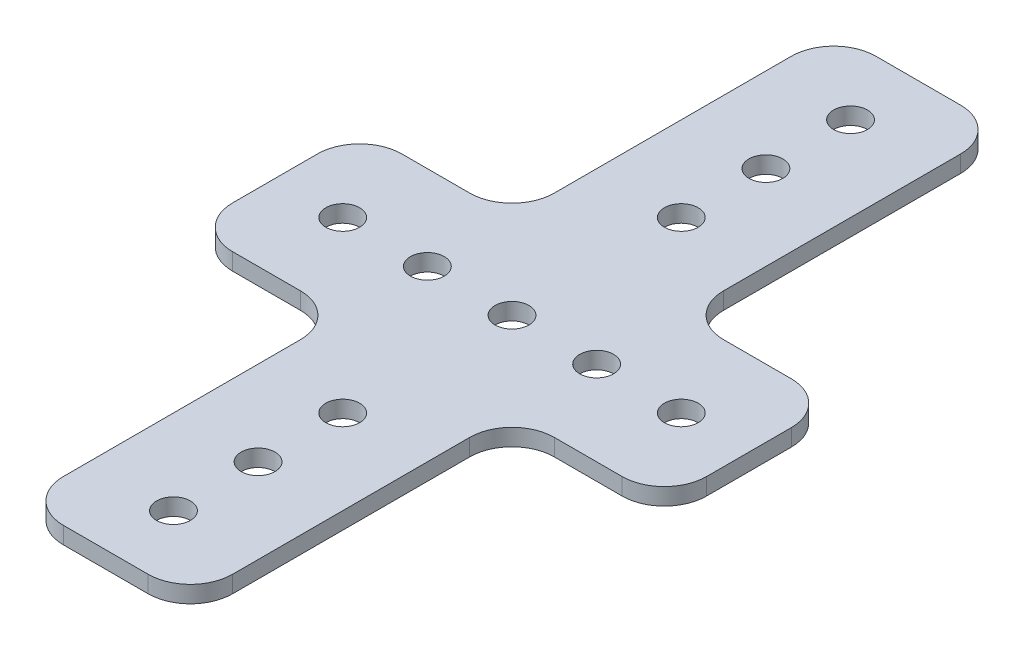
ISO-10303-21;
HEADER;
FILE_DESCRIPTION(('STEP AP214'),'2;1');
FILE_NAME('part.step','',(''),(''),'','','');
FILE_SCHEMA(('AUTOMOTIVE_DESIGN { 1 0 10303 214 1 1 1 1 }'));
ENDSEC;
DATA;
#1=APPLICATION_CONTEXT('core data for automotive mechanical design processes');
#2=APPLICATION_PROTOCOL_DEFINITION('international standard','automotive_design',2000,#1);
#3=PRODUCT_CONTEXT('',#1,'mechanical');
#4=PRODUCT('Part','Part','',(#3));
#5=PRODUCT_RELATED_PRODUCT_CATEGORY('part','',(#4));
#6=PRODUCT_DEFINITION_FORMATION('','',#4);
#7=PRODUCT_DEFINITION_CONTEXT('part definition',#1,'design');
#8=PRODUCT_DEFINITION('design','',#6,#7);
#9=PRODUCT_DEFINITION_SHAPE('','',#8);
#10=(LENGTH_UNIT() NAMED_UNIT(*) SI_UNIT(.MILLI.,.METRE.));
#11=(NAMED_UNIT(*) PLANE_ANGLE_UNIT() SI_UNIT($,.RADIAN.));
#12=(NAMED_UNIT(*) SI_UNIT($,.STERADIAN.) SOLID_ANGLE_UNIT());
#13=UNCERTAINTY_MEASURE_WITH_UNIT(LENGTH_MEASURE(1.E-05),#10,'distance_accuracy_value','');
#14=(GEOMETRIC_REPRESENTATION_CONTEXT(3) GLOBAL_UNCERTAINTY_ASSIGNED_CONTEXT((#13)) GLOBAL_UNIT_ASSIGNED_CONTEXT((#10,
#11,#12)) REPRESENTATION_CONTEXT('',''));
#15=CARTESIAN_POINT('',(0.,0.,0.));
#16=DIRECTION('',(0.,0.,1.));
#17=DIRECTION('',(1.,0.,0.));
#18=AXIS2_PLACEMENT_3D('',#15,#16,#17);
#19=CARTESIAN_POINT('',(0.,-2.,0.));
#20=DIRECTION('',(0.,-1.,0.));
#21=DIRECTION('',(0.,0.,-1.));
#22=AXIS2_PLACEMENT_3D('',#19,#20,#21);
#23=PLANE('',#22);
#24=CARTESIAN_POINT('',(0.,-2.,18.));
#25=DIRECTION('',(0.,1.,0.));
#26=DIRECTION('',(0.,0.,1.));
#27=AXIS2_PLACEMENT_3D('',#24,#25,#26);
#28=CIRCLE('',#27,1.99999999999999);
#29=CARTESIAN_POINT('',(0.,-2.,20.));
#30=VERTEX_POINT('',#29);
#31=EDGE_CURVE('E952',#30,#30,#28,.T.);
#32=ORIENTED_EDGE('',*,*,#31,.T.);
#33=EDGE_LOOP('',(#32));
#34=FACE_BOUND('',#33,.T.);
#35=CARTESIAN_POINT('',(10.,-2.,48.));
#36=DIRECTION('',(0.,1.,0.));
#37=DIRECTION('',(0.,0.,1.));
#38=AXIS2_PLACEMENT_3D('',#35,#36,#37);
#39=CIRCLE('',#38,1.99999999999999);
#40=CARTESIAN_POINT('',(10.,-2.,50.));
#41=VERTEX_POINT('',#40);
#42=EDGE_CURVE('E944',#41,#41,#39,.T.);
#43=ORIENTED_EDGE('',*,*,#42,.T.);
#44=EDGE_LOOP('',(#43));
#45=FACE_BOUND('',#44,.T.);
#46=DIRECTION('',(1.,0.,0.));
#47=VECTOR('',#46,1.);
#48=CARTESIAN_POINT('',(-10.,-2.,58.));
#49=LINE('',#48,#47);
#50=CARTESIAN_POINT('',(-23.,-2.,58.));
#51=VERTEX_POINT('',#50);
#52=CARTESIAN_POINT('',(-15.,-2.,58.));
#53=VERTEX_POINT('',#52);
#54=EDGE_CURVE('E453',#51,#53,#49,.T.);
#55=ORIENTED_EDGE('',*,*,#54,.F.);
#56=CARTESIAN_POINT('',(-23.,-2.,53.));
#57=DIRECTION('',(0.,-1.,0.));
#58=DIRECTION('',(0.,0.,-1.));
#59=AXIS2_PLACEMENT_3D('',#56,#57,#58);
#60=CIRCLE('',#59,5.);
#61=CARTESIAN_POINT('',(-28.,-2.,53.));
#62=VERTEX_POINT('',#61);
#63=EDGE_CURVE('E339',#51,#62,#60,.T.);
#64=ORIENTED_EDGE('',*,*,#63,.T.);
#65=DIRECTION('',(0.,0.,1.));
#66=VECTOR('',#65,1.);
#67=CARTESIAN_POINT('',(-28.,-2.,38.));
#68=LINE('',#67,#66);
#69=CARTESIAN_POINT('',(-28.,-2.,43.));
#70=VERTEX_POINT('',#69);
#71=EDGE_CURVE('E449',#70,#62,#68,.T.);
#72=ORIENTED_EDGE('',*,*,#71,.F.);
#73=CARTESIAN_POINT('',(-23.,-2.,43.));
#74=DIRECTION('',(0.,-1.,0.));
#75=DIRECTION('',(0.,0.,-1.));
#76=AXIS2_PLACEMENT_3D('',#73,#74,#75);
#77=CIRCLE('',#76,5.);
#78=CARTESIAN_POINT('',(-23.,-2.,38.));
#79=VERTEX_POINT('',#78);
#80=EDGE_CURVE('E63',#70,#79,#77,.T.);
#81=ORIENTED_EDGE('',*,*,#80,.T.);
#82=DIRECTION('',(-1.,0.,0.));
#83=VECTOR('',#82,1.);
#84=CARTESIAN_POINT('',(-28.,-2.,38.));
#85=LINE('',#84,#83);
#86=CARTESIAN_POINT('',(-15.,-2.,38.));
#87=VERTEX_POINT('',#86);
#88=EDGE_CURVE('E441',#87,#79,#85,.T.);
#89=ORIENTED_EDGE('',*,*,#88,.F.);
#90=CARTESIAN_POINT('',(-15.,-2.,33.));
#91=DIRECTION('',(0.,-1.,0.));
#92=DIRECTION('',(0.,0.,-1.));
#93=AXIS2_PLACEMENT_3D('',#90,#91,#92);
#94=CIRCLE('',#93,5.);
#95=CARTESIAN_POINT('',(-10.,-2.,33.));
#96=VERTEX_POINT('',#95);
#97=EDGE_CURVE('E224',#87,#96,#94,.F.);
#98=ORIENTED_EDGE('',*,*,#97,.T.);
#99=DIRECTION('',(0.,0.,1.));
#100=VECTOR('',#99,1.);
#101=CARTESIAN_POINT('',(-10.,-2.,38.));
#102=LINE('',#101,#100);
#103=CARTESIAN_POINT('',(-10.,-2.,5.));
#104=VERTEX_POINT('',#103);
#105=EDGE_CURVE('E228',#104,#96,#102,.T.);
#106=ORIENTED_EDGE('',*,*,#105,.F.);
#107=CARTESIAN_POINT('',(-5.,-2.,5.));
#108=DIRECTION('',(0.,-1.,0.));
#109=DIRECTION('',(0.,0.,-1.));
#110=AXIS2_PLACEMENT_3D('',#107,#108,#109);
#111=CIRCLE('',#110,5.);
#112=CARTESIAN_POINT('',(-5.,-2.,0.));
#113=VERTEX_POINT('',#112);
#114=EDGE_CURVE('E334',#104,#113,#111,.T.);
#115=ORIENTED_EDGE('',*,*,#114,.T.);
#116=DIRECTION('',(-1.,0.,0.));
#117=VECTOR('',#116,1.);
#118=CARTESIAN_POINT('',(-10.,-2.,0.));
#119=LINE('',#118,#117);
#120=CARTESIAN_POINT('',(5.,-2.,0.));
#121=VERTEX_POINT('',#120);
#122=EDGE_CURVE('E432',#121,#113,#119,.T.);
#123=ORIENTED_EDGE('',*,*,#122,.F.);
#124=CARTESIAN_POINT('',(5.,-2.,5.));
#125=DIRECTION('',(0.,-1.,0.));
#126=DIRECTION('',(0.,0.,-1.));
#127=AXIS2_PLACEMENT_3D('',#124,#125,#126);
#128=CIRCLE('',#127,5.);
#129=CARTESIAN_POINT('',(10.,-2.,5.));
#130=VERTEX_POINT('',#129);
#131=EDGE_CURVE('E331',#121,#130,#128,.T.);
#132=ORIENTED_EDGE('',*,*,#131,.T.);
#133=DIRECTION('',(0.,0.,-1.));
#134=VECTOR('',#133,1.);
#135=CARTESIAN_POINT('',(10.,-2.,0.));
#136=LINE('',#135,#134);
#137=CARTESIAN_POINT('',(9.99999999999999,-2.,33.));
#138=VERTEX_POINT('',#137);
#139=EDGE_CURVE('E231',#138,#130,#136,.T.);
#140=ORIENTED_EDGE('',*,*,#139,.F.);
#141=CARTESIAN_POINT('',(15.,-2.,33.));
#142=DIRECTION('',(0.,-1.,0.));
#143=DIRECTION('',(0.,0.,-1.));
#144=AXIS2_PLACEMENT_3D('',#141,#142,#143);
#145=CIRCLE('',#144,5.);
#146=CARTESIAN_POINT('',(15.,-2.,38.));
#147=VERTEX_POINT('',#146);
#148=EDGE_CURVE('E282',#138,#147,#145,.F.);
#149=ORIENTED_EDGE('',*,*,#148,.T.);
#150=DIRECTION('',(-1.,0.,0.));
#151=VECTOR('',#150,1.);
#152=CARTESIAN_POINT('',(9.99999999999999,-2.,38.));
#153=LINE('',#152,#151);
#154=CARTESIAN_POINT('',(23.,-2.,38.));
#155=VERTEX_POINT('',#154);
#156=EDGE_CURVE('E238',#155,#147,#153,.T.);
#157=ORIENTED_EDGE('',*,*,#156,.F.);
#158=CARTESIAN_POINT('',(23.,-2.,43.));
#159=DIRECTION('',(0.,-1.,0.));
#160=DIRECTION('',(0.,0.,-1.));
#161=AXIS2_PLACEMENT_3D('',#158,#159,#160);
#162=CIRCLE('',#161,5.);
#163=CARTESIAN_POINT('',(28.,-2.,43.));
#164=VERTEX_POINT('',#163);
#165=EDGE_CURVE('E328',#155,#164,#162,.T.);
#166=ORIENTED_EDGE('',*,*,#165,.T.);
#167=DIRECTION('',(0.,0.,-1.));
#168=VECTOR('',#167,1.);
#169=CARTESIAN_POINT('',(28.,-2.,58.));
#170=LINE('',#169,#168);
#171=CARTESIAN_POINT('',(28.,-2.,53.));
#172=VERTEX_POINT('',#171);
#173=EDGE_CURVE('E465',#172,#164,#170,.T.);
#174=ORIENTED_EDGE('',*,*,#173,.F.);
#175=CARTESIAN_POINT('',(23.,-2.,53.));
#176=DIRECTION('',(0.,-1.,0.));
#177=DIRECTION('',(0.,0.,-1.));
#178=AXIS2_PLACEMENT_3D('',#175,#176,#177);
#179=CIRCLE('',#178,5.);
#180=CARTESIAN_POINT('',(23.,-2.,58.));
#181=VERTEX_POINT('',#180);
#182=EDGE_CURVE('E325',#172,#181,#179,.T.);
#183=ORIENTED_EDGE('',*,*,#182,.T.);
#184=DIRECTION('',(1.,0.,0.));
#185=VECTOR('',#184,1.);
#186=CARTESIAN_POINT('',(28.,-2.,58.));
#187=LINE('',#186,#185);
#188=CARTESIAN_POINT('',(15.,-2.,58.));
#189=VERTEX_POINT('',#188);
#190=EDGE_CURVE('E397',#189,#181,#187,.T.);
#191=ORIENTED_EDGE('',*,*,#190,.F.);
#192=CARTESIAN_POINT('',(15.,-2.,63.));
#193=DIRECTION('',(0.,-1.,0.));
#194=DIRECTION('',(0.,0.,-1.));
#195=AXIS2_PLACEMENT_3D('',#192,#193,#194);
#196=CIRCLE('',#195,5.);
#197=CARTESIAN_POINT('',(10.,-2.,63.));
#198=VERTEX_POINT('',#197);
#199=EDGE_CURVE('E275',#189,#198,#196,.F.);
#200=ORIENTED_EDGE('',*,*,#199,.T.);
#201=DIRECTION('',(0.,0.,-1.));
#202=VECTOR('',#201,1.);
#203=CARTESIAN_POINT('',(10.,-2.,58.));
#204=LINE('',#203,#202);
#205=CARTESIAN_POINT('',(10.,-2.,91.));
#206=VERTEX_POINT('',#205);
#207=EDGE_CURVE('E385',#206,#198,#204,.T.);
#208=ORIENTED_EDGE('',*,*,#207,.F.);
#209=CARTESIAN_POINT('',(5.,-2.,91.));
#210=DIRECTION('',(0.,-1.,0.));
#211=DIRECTION('',(0.,0.,-1.));
#212=AXIS2_PLACEMENT_3D('',#209,#210,#211);
#213=CIRCLE('',#212,5.);
#214=CARTESIAN_POINT('',(5.,-2.,96.));
#215=VERTEX_POINT('',#214);
#216=EDGE_CURVE('E322',#206,#215,#213,.T.);
#217=ORIENTED_EDGE('',*,*,#216,.T.);
#218=DIRECTION('',(1.,0.,0.));
#219=VECTOR('',#218,1.);
#220=CARTESIAN_POINT('',(-10.,-2.,96.));
#221=LINE('',#220,#219);
#222=CARTESIAN_POINT('',(-5.,-2.,96.));
#223=VERTEX_POINT('',#222);
#224=EDGE_CURVE('E398',#223,#215,#221,.T.);
#225=ORIENTED_EDGE('',*,*,#224,.F.);
#226=CARTESIAN_POINT('',(-5.,-2.,91.));
#227=DIRECTION('',(0.,-1.,0.));
#228=DIRECTION('',(0.,0.,-1.));
#229=AXIS2_PLACEMENT_3D('',#226,#227,#228);
#230=CIRCLE('',#229,5.);
#231=CARTESIAN_POINT('',(-10.,-2.,91.));
#232=VERTEX_POINT('',#231);
#233=EDGE_CURVE('E319',#223,#232,#230,.T.);
#234=ORIENTED_EDGE('',*,*,#233,.T.);
#235=DIRECTION('',(0.,0.,1.));
#236=VECTOR('',#235,1.);
#237=CARTESIAN_POINT('',(-10.,-2.,96.));
#238=LINE('',#237,#236);
#239=CARTESIAN_POINT('',(-10.,-2.,63.));
#240=VERTEX_POINT('',#239);
#241=EDGE_CURVE('E456',#240,#232,#238,.T.);
#242=ORIENTED_EDGE('',*,*,#241,.F.);
#243=CARTESIAN_POINT('',(-15.,-2.,63.));
#244=DIRECTION('',(0.,-1.,0.));
#245=DIRECTION('',(0.,0.,-1.));
#246=AXIS2_PLACEMENT_3D('',#243,#244,#245);
#247=CIRCLE('',#246,5.);
#248=EDGE_CURVE('E268',#240,#53,#247,.F.);
#249=ORIENTED_EDGE('',*,*,#248,.T.);
#250=EDGE_LOOP('',(#55,#64,#72,#81,#89,#98,#106,#115,#123,#132,#140,#149,#157,#166,#174,#183,
#191,#200,#208,#217,#225,#234,#242,#249));
#251=FACE_BOUND('',#250,.T.);
#252=CARTESIAN_POINT('',(0.,-2.,8.));
#253=DIRECTION('',(0.,1.,0.));
#254=DIRECTION('',(0.,0.,1.));
#255=AXIS2_PLACEMENT_3D('',#252,#253,#254);
#256=CIRCLE('',#255,2.);
#257=CARTESIAN_POINT('',(0.,-2.,10.));
#258=VERTEX_POINT('',#257);
#259=EDGE_CURVE('E444',#258,#258,#256,.T.);
#260=ORIENTED_EDGE('',*,*,#259,.T.);
#261=EDGE_LOOP('',(#260));
#262=FACE_BOUND('',#261,.T.);
#263=CARTESIAN_POINT('',(20.,-2.,48.));
#264=DIRECTION('',(0.,1.,0.));
#265=DIRECTION('',(0.,0.,1.));
#266=AXIS2_PLACEMENT_3D('',#263,#264,#265);
#267=CIRCLE('',#266,2.);
#268=CARTESIAN_POINT('',(20.,-2.,50.));
#269=VERTEX_POINT('',#268);
#270=EDGE_CURVE('E878',#269,#269,#267,.T.);
#271=ORIENTED_EDGE('',*,*,#270,.T.);
#272=EDGE_LOOP('',(#271));
#273=FACE_BOUND('',#272,.T.);
#274=CARTESIAN_POINT('',(-20.,-2.,48.));
#275=DIRECTION('',(0.,1.,0.));
#276=DIRECTION('',(0.,0.,1.));
#277=AXIS2_PLACEMENT_3D('',#274,#275,#276);
#278=CIRCLE('',#277,2.);
#279=CARTESIAN_POINT('',(-20.,-2.,50.));
#280=VERTEX_POINT('',#279);
#281=EDGE_CURVE('E888',#280,#280,#278,.T.);
#282=ORIENTED_EDGE('',*,*,#281,.T.);
#283=EDGE_LOOP('',(#282));
#284=FACE_BOUND('',#283,.T.);
#285=CARTESIAN_POINT('',(0.,-2.,88.));
#286=DIRECTION('',(0.,1.,0.));
#287=DIRECTION('',(0.,0.,1.));
#288=AXIS2_PLACEMENT_3D('',#285,#286,#287);
#289=CIRCLE('',#288,2.);
#290=CARTESIAN_POINT('',(0.,-2.,90.));
#291=VERTEX_POINT('',#290);
#292=EDGE_CURVE('E896',#291,#291,#289,.T.);
#293=ORIENTED_EDGE('',*,*,#292,.T.);
#294=EDGE_LOOP('',(#293));
#295=FACE_BOUND('',#294,.T.);
#296=CARTESIAN_POINT('',(0.,-2.,68.));
#297=DIRECTION('',(0.,1.,0.));
#298=DIRECTION('',(0.,0.,1.));
#299=AXIS2_PLACEMENT_3D('',#296,#297,#298);
#300=CIRCLE('',#299,2.);
#301=CARTESIAN_POINT('',(0.,-2.,70.));
#302=VERTEX_POINT('',#301);
#303=EDGE_CURVE('E904',#302,#302,#300,.T.);
#304=ORIENTED_EDGE('',*,*,#303,.T.);
#305=EDGE_LOOP('',(#304));
#306=FACE_BOUND('',#305,.T.);
#307=CARTESIAN_POINT('',(0.,-2.,48.));
#308=DIRECTION('',(0.,1.,0.));
#309=DIRECTION('',(0.,0.,1.));
#310=AXIS2_PLACEMENT_3D('',#307,#308,#309);
#311=CIRCLE('',#310,2.);
#312=CARTESIAN_POINT('',(0.,-2.,50.));
#313=VERTEX_POINT('',#312);
#314=EDGE_CURVE('E912',#313,#313,#311,.T.);
#315=ORIENTED_EDGE('',*,*,#314,.T.);
#316=EDGE_LOOP('',(#315));
#317=FACE_BOUND('',#316,.T.);
#318=CARTESIAN_POINT('',(0.,-2.,28.));
#319=DIRECTION('',(0.,1.,0.));
#320=DIRECTION('',(0.,0.,1.));
#321=AXIS2_PLACEMENT_3D('',#318,#319,#320);
#322=CIRCLE('',#321,2.);
#323=CARTESIAN_POINT('',(0.,-2.,30.));
#324=VERTEX_POINT('',#323);
#325=EDGE_CURVE('E920',#324,#324,#322,.T.);
#326=ORIENTED_EDGE('',*,*,#325,.T.);
#327=EDGE_LOOP('',(#326));
#328=FACE_BOUND('',#327,.T.);
#329=CARTESIAN_POINT('',(0.,-2.,78.));
#330=DIRECTION('',(0.,1.,0.));
#331=DIRECTION('',(0.,0.,1.));
#332=AXIS2_PLACEMENT_3D('',#329,#330,#331);
#333=CIRCLE('',#332,1.99999999999999);
#334=CARTESIAN_POINT('',(0.,-2.,80.));
#335=VERTEX_POINT('',#334);
#336=EDGE_CURVE('E928',#335,#335,#333,.T.);
#337=ORIENTED_EDGE('',*,*,#336,.T.);
#338=EDGE_LOOP('',(#337));
#339=FACE_BOUND('',#338,.T.);
#340=CARTESIAN_POINT('',(-10.,-2.,48.));
#341=DIRECTION('',(0.,1.,0.));
#342=DIRECTION('',(0.,0.,1.));
#343=AXIS2_PLACEMENT_3D('',#340,#341,#342);
#344=CIRCLE('',#343,1.99999999999999);
#345=CARTESIAN_POINT('',(-10.,-2.,50.));
#346=VERTEX_POINT('',#345);
#347=EDGE_CURVE('E936',#346,#346,#344,.T.);
#348=ORIENTED_EDGE('',*,*,#347,.T.);
#349=EDGE_LOOP('',(#348));
#350=FACE_BOUND('',#349,.T.);
#351=ADVANCED_FACE('F39',(#34,#45,#251,#262,#273,#284,#295,#306,#317,#328,#339,#350),#23,.T.);
#352=CARTESIAN_POINT('',(-10.,-2.,0.));
#353=DIRECTION('',(0.,0.,-1.));
#354=DIRECTION('',(-1.,0.,0.));
#355=AXIS2_PLACEMENT_3D('',#352,#353,#354);
#356=PLANE('',#355);
#357=ORIENTED_EDGE('',*,*,#122,.T.);
#358=DIRECTION('',(0.,1.,0.));
#359=VECTOR('',#358,1.);
#360=CARTESIAN_POINT('',(-5.,-2.,0.));
#361=LINE('',#360,#359);
#362=CARTESIAN_POINT('',(-5.,0.,0.));
#363=VERTEX_POINT('',#362);
#364=EDGE_CURVE('E349',#113,#363,#361,.T.);
#365=ORIENTED_EDGE('',*,*,#364,.T.);
#366=DIRECTION('',(-1.,0.,0.));
#367=VECTOR('',#366,1.);
#368=CARTESIAN_POINT('',(-10.,0.,0.));
#369=LINE('',#368,#367);
#370=CARTESIAN_POINT('',(5.,0.,0.));
#371=VERTEX_POINT('',#370);
#372=EDGE_CURVE('E214',#371,#363,#369,.T.);
#373=ORIENTED_EDGE('',*,*,#372,.F.);
#374=DIRECTION('',(0.,1.,0.));
#375=VECTOR('',#374,1.);
#376=CARTESIAN_POINT('',(5.,-2.,0.));
#377=LINE('',#376,#375);
#378=EDGE_CURVE('E346',#371,#121,#377,.F.);
#379=ORIENTED_EDGE('',*,*,#378,.T.);
#380=EDGE_LOOP('',(#357,#365,#373,#379));
#381=FACE_BOUND('',#380,.T.);
#382=ADVANCED_FACE('F502',(#381),#356,.T.);
#383=CARTESIAN_POINT('',(10.,-2.,0.));
#384=DIRECTION('',(1.,0.,0.));
#385=DIRECTION('',(0.,0.,-1.));
#386=AXIS2_PLACEMENT_3D('',#383,#384,#385);
#387=PLANE('',#386);
#388=ORIENTED_EDGE('',*,*,#139,.T.);
#389=DIRECTION('',(0.,1.,0.));
#390=VECTOR('',#389,1.);
#391=CARTESIAN_POINT('',(10.,-2.,5.));
#392=LINE('',#391,#390);
#393=CARTESIAN_POINT('',(10.,0.,5.));
#394=VERTEX_POINT('',#393);
#395=EDGE_CURVE('E355',#130,#394,#392,.T.);
#396=ORIENTED_EDGE('',*,*,#395,.T.);
#397=DIRECTION('',(0.,0.,-1.));
#398=VECTOR('',#397,1.);
#399=CARTESIAN_POINT('',(10.,0.,0.));
#400=LINE('',#399,#398);
#401=CARTESIAN_POINT('',(9.99999999999999,0.,33.));
#402=VERTEX_POINT('',#401);
#403=EDGE_CURVE('E241',#402,#394,#400,.T.);
#404=ORIENTED_EDGE('',*,*,#403,.F.);
#405=DIRECTION('',(0.,1.,0.));
#406=VECTOR('',#405,1.);
#407=CARTESIAN_POINT('',(9.99999999999999,-2.,33.));
#408=LINE('',#407,#406);
#409=EDGE_CURVE('E225',#402,#138,#408,.F.);
#410=ORIENTED_EDGE('',*,*,#409,.T.);
#411=EDGE_LOOP('',(#388,#396,#404,#410));
#412=FACE_BOUND('',#411,.T.);
#413=ADVANCED_FACE('F508',(#412),#387,.T.);
#414=CARTESIAN_POINT('',(9.99999999999999,-2.,38.));
#415=DIRECTION('',(0.,0.,-1.));
#416=DIRECTION('',(-1.,0.,0.));
#417=AXIS2_PLACEMENT_3D('',#414,#415,#416);
#418=PLANE('',#417);
#419=DIRECTION('',(-1.,0.,0.));
#420=VECTOR('',#419,1.);
#421=CARTESIAN_POINT('',(9.99999999999999,0.,38.));
#422=LINE('',#421,#420);
#423=CARTESIAN_POINT('',(23.,0.,38.));
#424=VERTEX_POINT('',#423);
#425=CARTESIAN_POINT('',(15.,0.,38.));
#426=VERTEX_POINT('',#425);
#427=EDGE_CURVE('E426',#424,#426,#422,.T.);
#428=ORIENTED_EDGE('',*,*,#427,.F.);
#429=DIRECTION('',(0.,1.,0.));
#430=VECTOR('',#429,1.);
#431=CARTESIAN_POINT('',(23.,-2.,38.));
#432=LINE('',#431,#430);
#433=EDGE_CURVE('E366',#424,#155,#432,.F.);
#434=ORIENTED_EDGE('',*,*,#433,.T.);
#435=ORIENTED_EDGE('',*,*,#156,.T.);
#436=DIRECTION('',(0.,1.,0.));
#437=VECTOR('',#436,1.);
#438=CARTESIAN_POINT('',(15.,0.,38.));
#439=LINE('',#438,#437);
#440=EDGE_CURVE('E257',#147,#426,#439,.T.);
#441=ORIENTED_EDGE('',*,*,#440,.T.);
#442=EDGE_LOOP('',(#428,#434,#435,#441));
#443=FACE_BOUND('',#442,.T.);
#444=ADVANCED_FACE('F521',(#443),#418,.T.);
#445=CARTESIAN_POINT('',(28.,-2.,58.));
#446=DIRECTION('',(1.,0.,0.));
#447=DIRECTION('',(0.,0.,-1.));
#448=AXIS2_PLACEMENT_3D('',#445,#446,#447);
#449=PLANE('',#448);
#450=ORIENTED_EDGE('',*,*,#173,.T.);
#451=DIRECTION('',(0.,1.,0.));
#452=VECTOR('',#451,1.);
#453=CARTESIAN_POINT('',(28.,-2.,43.));
#454=LINE('',#453,#452);
#455=CARTESIAN_POINT('',(28.,0.,43.));
#456=VERTEX_POINT('',#455);
#457=EDGE_CURVE('E362',#164,#456,#454,.T.);
#458=ORIENTED_EDGE('',*,*,#457,.T.);
#459=DIRECTION('',(0.,0.,-1.));
#460=VECTOR('',#459,1.);
#461=CARTESIAN_POINT('',(28.,0.,58.));
#462=LINE('',#461,#460);
#463=CARTESIAN_POINT('',(28.,0.,53.));
#464=VERTEX_POINT('',#463);
#465=EDGE_CURVE('E423',#464,#456,#462,.T.);
#466=ORIENTED_EDGE('',*,*,#465,.F.);
#467=DIRECTION('',(0.,1.,0.));
#468=VECTOR('',#467,1.);
#469=CARTESIAN_POINT('',(28.,-2.,53.));
#470=LINE('',#469,#468);
#471=EDGE_CURVE('E359',#464,#172,#470,.F.);
#472=ORIENTED_EDGE('',*,*,#471,.T.);
#473=EDGE_LOOP('',(#450,#458,#466,#472));
#474=FACE_BOUND('',#473,.T.);
#475=ADVANCED_FACE('F525',(#474),#449,.T.);
#476=CARTESIAN_POINT('',(28.,-2.,58.));
#477=DIRECTION('',(0.,0.,1.));
#478=DIRECTION('',(1.,0.,0.));
#479=AXIS2_PLACEMENT_3D('',#476,#477,#478);
#480=PLANE('',#479);
#481=ORIENTED_EDGE('',*,*,#190,.T.);
#482=DIRECTION('',(0.,1.,0.));
#483=VECTOR('',#482,1.);
#484=CARTESIAN_POINT('',(23.,-2.,58.));
#485=LINE('',#484,#483);
#486=CARTESIAN_POINT('',(23.,0.,58.));
#487=VERTEX_POINT('',#486);
#488=EDGE_CURVE('E369',#181,#487,#485,.T.);
#489=ORIENTED_EDGE('',*,*,#488,.T.);
#490=DIRECTION('',(1.,0.,0.));
#491=VECTOR('',#490,1.);
#492=CARTESIAN_POINT('',(28.,0.,58.));
#493=LINE('',#492,#491);
#494=CARTESIAN_POINT('',(15.,0.,58.));
#495=VERTEX_POINT('',#494);
#496=EDGE_CURVE('E414',#495,#487,#493,.T.);
#497=ORIENTED_EDGE('',*,*,#496,.F.);
#498=DIRECTION('',(0.,1.,0.));
#499=VECTOR('',#498,1.);
#500=CARTESIAN_POINT('',(15.,-2.,58.));
#501=LINE('',#500,#499);
#502=EDGE_CURVE('E254',#495,#189,#501,.F.);
#503=ORIENTED_EDGE('',*,*,#502,.T.);
#504=EDGE_LOOP('',(#481,#489,#497,#503));
#505=FACE_BOUND('',#504,.T.);
#506=ADVANCED_FACE('F529',(#505),#480,.T.);
#507=CARTESIAN_POINT('',(10.,-2.,58.));
#508=DIRECTION('',(1.,0.,0.));
#509=DIRECTION('',(0.,0.,-1.));
#510=AXIS2_PLACEMENT_3D('',#507,#508,#509);
#511=PLANE('',#510);
#512=DIRECTION('',(0.,0.,-1.));
#513=VECTOR('',#512,1.);
#514=CARTESIAN_POINT('',(10.,0.,58.));
#515=LINE('',#514,#513);
#516=CARTESIAN_POINT('',(10.,0.,91.));
#517=VERTEX_POINT('',#516);
#518=CARTESIAN_POINT('',(10.,0.,63.));
#519=VERTEX_POINT('',#518);
#520=EDGE_CURVE('E386',#517,#519,#515,.T.);
#521=ORIENTED_EDGE('',*,*,#520,.F.);
#522=DIRECTION('',(0.,1.,0.));
#523=VECTOR('',#522,1.);
#524=CARTESIAN_POINT('',(10.,-2.,91.));
#525=LINE('',#524,#523);
#526=EDGE_CURVE('E48',#517,#206,#525,.F.);
#527=ORIENTED_EDGE('',*,*,#526,.T.);
#528=ORIENTED_EDGE('',*,*,#207,.T.);
#529=DIRECTION('',(0.,1.,0.));
#530=VECTOR('',#529,1.);
#531=CARTESIAN_POINT('',(10.,0.,63.));
#532=LINE('',#531,#530);
#533=EDGE_CURVE('E250',#198,#519,#532,.T.);
#534=ORIENTED_EDGE('',*,*,#533,.T.);
#535=EDGE_LOOP('',(#521,#527,#528,#534));
#536=FACE_BOUND('',#535,.T.);
#537=ADVANCED_FACE('F384',(#536),#511,.T.);
#538=CARTESIAN_POINT('',(-10.,-2.,96.));
#539=DIRECTION('',(0.,0.,1.));
#540=DIRECTION('',(1.,0.,0.));
#541=AXIS2_PLACEMENT_3D('',#538,#539,#540);
#542=PLANE('',#541);
#543=ORIENTED_EDGE('',*,*,#224,.T.);
#544=DIRECTION('',(0.,1.,0.));
#545=VECTOR('',#544,1.);
#546=CARTESIAN_POINT('',(5.,-2.,96.));
#547=LINE('',#546,#545);
#548=CARTESIAN_POINT('',(5.,0.,96.));
#549=VERTEX_POINT('',#548);
#550=EDGE_CURVE('E376',#215,#549,#547,.T.);
#551=ORIENTED_EDGE('',*,*,#550,.T.);
#552=DIRECTION('',(1.,0.,0.));
#553=VECTOR('',#552,1.);
#554=CARTESIAN_POINT('',(-10.,0.,96.));
#555=LINE('',#554,#553);
#556=CARTESIAN_POINT('',(-5.,0.,96.));
#557=VERTEX_POINT('',#556);
#558=EDGE_CURVE('E406',#557,#549,#555,.T.);
#559=ORIENTED_EDGE('',*,*,#558,.F.);
#560=DIRECTION('',(0.,1.,0.));
#561=VECTOR('',#560,1.);
#562=CARTESIAN_POINT('',(-5.,-2.,96.));
#563=LINE('',#562,#561);
#564=EDGE_CURVE('E373',#557,#223,#563,.F.);
#565=ORIENTED_EDGE('',*,*,#564,.T.);
#566=EDGE_LOOP('',(#543,#551,#559,#565));
#567=FACE_BOUND('',#566,.T.);
#568=ADVANCED_FACE('F405',(#567),#542,.T.);
#569=CARTESIAN_POINT('',(-10.,-2.,96.));
#570=DIRECTION('',(-1.,0.,0.));
#571=DIRECTION('',(0.,0.,1.));
#572=AXIS2_PLACEMENT_3D('',#569,#570,#571);
#573=PLANE('',#572);
#574=ORIENTED_EDGE('',*,*,#241,.T.);
#575=DIRECTION('',(0.,1.,0.));
#576=VECTOR('',#575,1.);
#577=CARTESIAN_POINT('',(-10.,-2.,91.));
#578=LINE('',#577,#576);
#579=CARTESIAN_POINT('',(-10.,0.,91.));
#580=VERTEX_POINT('',#579);
#581=EDGE_CURVE('E11',#232,#580,#578,.T.);
#582=ORIENTED_EDGE('',*,*,#581,.T.);
#583=DIRECTION('',(0.,0.,1.));
#584=VECTOR('',#583,1.);
#585=CARTESIAN_POINT('',(-10.,0.,96.));
#586=LINE('',#585,#584);
#587=CARTESIAN_POINT('',(-10.,0.,63.));
#588=VERTEX_POINT('',#587);
#589=EDGE_CURVE('E410',#588,#580,#586,.T.);
#590=ORIENTED_EDGE('',*,*,#589,.F.);
#591=DIRECTION('',(0.,1.,0.));
#592=VECTOR('',#591,1.);
#593=CARTESIAN_POINT('',(-10.,-2.,63.));
#594=LINE('',#593,#592);
#595=EDGE_CURVE('E247',#588,#240,#594,.F.);
#596=ORIENTED_EDGE('',*,*,#595,.T.);
#597=EDGE_LOOP('',(#574,#582,#590,#596));
#598=FACE_BOUND('',#597,.T.);
#599=ADVANCED_FACE('F494',(#598),#573,.T.);
#600=CARTESIAN_POINT('',(-10.,-2.,58.));
#601=DIRECTION('',(0.,0.,1.));
#602=DIRECTION('',(1.,0.,0.));
#603=AXIS2_PLACEMENT_3D('',#600,#601,#602);
#604=PLANE('',#603);
#605=DIRECTION('',(1.,0.,0.));
#606=VECTOR('',#605,1.);
#607=CARTESIAN_POINT('',(-10.,0.,58.));
#608=LINE('',#607,#606);
#609=CARTESIAN_POINT('',(-23.,0.,58.));
#610=VERTEX_POINT('',#609);
#611=CARTESIAN_POINT('',(-15.,0.,58.));
#612=VERTEX_POINT('',#611);
#613=EDGE_CURVE('E416',#610,#612,#608,.T.);
#614=ORIENTED_EDGE('',*,*,#613,.F.);
#615=DIRECTION('',(0.,1.,0.));
#616=VECTOR('',#615,1.);
#617=CARTESIAN_POINT('',(-23.,-2.,58.));
#618=LINE('',#617,#616);
#619=EDGE_CURVE('E316',#610,#51,#618,.F.);
#620=ORIENTED_EDGE('',*,*,#619,.T.);
#621=ORIENTED_EDGE('',*,*,#54,.T.);
#622=DIRECTION('',(0.,1.,0.));
#623=VECTOR('',#622,1.);
#624=CARTESIAN_POINT('',(-15.,0.,58.));
#625=LINE('',#624,#623);
#626=EDGE_CURVE('E235',#53,#612,#625,.T.);
#627=ORIENTED_EDGE('',*,*,#626,.T.);
#628=EDGE_LOOP('',(#614,#620,#621,#627));
#629=FACE_BOUND('',#628,.T.);
#630=ADVANCED_FACE('F488',(#629),#604,.T.);
#631=CARTESIAN_POINT('',(-28.,-2.,38.));
#632=DIRECTION('',(-1.,0.,0.));
#633=DIRECTION('',(0.,0.,1.));
#634=AXIS2_PLACEMENT_3D('',#631,#632,#633);
#635=PLANE('',#634);
#636=ORIENTED_EDGE('',*,*,#71,.T.);
#637=DIRECTION('',(0.,1.,0.));
#638=VECTOR('',#637,1.);
#639=CARTESIAN_POINT('',(-28.,-2.,53.));
#640=LINE('',#639,#638);
#641=CARTESIAN_POINT('',(-28.,0.,53.));
#642=VERTEX_POINT('',#641);
#643=EDGE_CURVE('E289',#62,#642,#640,.T.);
#644=ORIENTED_EDGE('',*,*,#643,.T.);
#645=DIRECTION('',(0.,0.,1.));
#646=VECTOR('',#645,1.);
#647=CARTESIAN_POINT('',(-28.,0.,38.));
#648=LINE('',#647,#646);
#649=CARTESIAN_POINT('',(-28.,0.,43.));
#650=VERTEX_POINT('',#649);
#651=EDGE_CURVE('E475',#650,#642,#648,.T.);
#652=ORIENTED_EDGE('',*,*,#651,.F.);
#653=DIRECTION('',(0.,1.,0.));
#654=VECTOR('',#653,1.);
#655=CARTESIAN_POINT('',(-28.,-2.,43.));
#656=LINE('',#655,#654);
#657=EDGE_CURVE('E286',#650,#70,#656,.F.);
#658=ORIENTED_EDGE('',*,*,#657,.T.);
#659=EDGE_LOOP('',(#636,#644,#652,#658));
#660=FACE_BOUND('',#659,.T.);
#661=ADVANCED_FACE('F542',(#660),#635,.T.);
#662=CARTESIAN_POINT('',(-28.,-2.,38.));
#663=DIRECTION('',(0.,0.,-1.));
#664=DIRECTION('',(-1.,0.,0.));
#665=AXIS2_PLACEMENT_3D('',#662,#663,#664);
#666=PLANE('',#665);
#667=ORIENTED_EDGE('',*,*,#88,.T.);
#668=DIRECTION('',(0.,1.,0.));
#669=VECTOR('',#668,1.);
#670=CARTESIAN_POINT('',(-23.,-2.,38.));
#671=LINE('',#670,#669);
#672=CARTESIAN_POINT('',(-23.,0.,38.));
#673=VERTEX_POINT('',#672);
#674=EDGE_CURVE('E342',#79,#673,#671,.T.);
#675=ORIENTED_EDGE('',*,*,#674,.T.);
#676=DIRECTION('',(-1.,0.,0.));
#677=VECTOR('',#676,1.);
#678=CARTESIAN_POINT('',(-28.,0.,38.));
#679=LINE('',#678,#677);
#680=CARTESIAN_POINT('',(-15.,0.,38.));
#681=VERTEX_POINT('',#680);
#682=EDGE_CURVE('E213',#681,#673,#679,.T.);
#683=ORIENTED_EDGE('',*,*,#682,.F.);
#684=DIRECTION('',(0.,1.,0.));
#685=VECTOR('',#684,1.);
#686=CARTESIAN_POINT('',(-15.,-2.,38.));
#687=LINE('',#686,#685);
#688=EDGE_CURVE('E222',#681,#87,#687,.F.);
#689=ORIENTED_EDGE('',*,*,#688,.T.);
#690=EDGE_LOOP('',(#667,#675,#683,#689));
#691=FACE_BOUND('',#690,.T.);
#692=ADVANCED_FACE('F545',(#691),#666,.T.);
#693=CARTESIAN_POINT('',(-10.,-2.,38.));
#694=DIRECTION('',(-1.,0.,0.));
#695=DIRECTION('',(0.,0.,1.));
#696=AXIS2_PLACEMENT_3D('',#693,#694,#695);
#697=PLANE('',#696);
#698=DIRECTION('',(0.,0.,1.));
#699=VECTOR('',#698,1.);
#700=CARTESIAN_POINT('',(-10.,0.,38.));
#701=LINE('',#700,#699);
#702=CARTESIAN_POINT('',(-10.,0.,5.));
#703=VERTEX_POINT('',#702);
#704=CARTESIAN_POINT('',(-10.,0.,33.));
#705=VERTEX_POINT('',#704);
#706=EDGE_CURVE('E202',#703,#705,#701,.T.);
#707=ORIENTED_EDGE('',*,*,#706,.F.);
#708=DIRECTION('',(0.,1.,0.));
#709=VECTOR('',#708,1.);
#710=CARTESIAN_POINT('',(-10.,-2.,5.));
#711=LINE('',#710,#709);
#712=EDGE_CURVE('E55',#703,#104,#711,.F.);
#713=ORIENTED_EDGE('',*,*,#712,.T.);
#714=ORIENTED_EDGE('',*,*,#105,.T.);
#715=DIRECTION('',(0.,1.,0.));
#716=VECTOR('',#715,1.);
#717=CARTESIAN_POINT('',(-10.,0.,33.));
#718=LINE('',#717,#716);
#719=EDGE_CURVE('E221',#96,#705,#718,.T.);
#720=ORIENTED_EDGE('',*,*,#719,.T.);
#721=EDGE_LOOP('',(#707,#713,#714,#720));
#722=FACE_BOUND('',#721,.T.);
#723=ADVANCED_FACE('F227',(#722),#697,.T.);
#724=CARTESIAN_POINT('',(0.,0.,0.));
#725=DIRECTION('',(0.,-1.,0.));
#726=DIRECTION('',(0.,0.,-1.));
#727=AXIS2_PLACEMENT_3D('',#724,#725,#726);
#728=PLANE('',#727);
#729=CARTESIAN_POINT('',(0.,0.,18.));
#730=DIRECTION('',(0.,1.,0.));
#731=DIRECTION('',(0.,0.,1.));
#732=AXIS2_PLACEMENT_3D('',#729,#730,#731);
#733=CIRCLE('',#732,1.99999999999999);
#734=CARTESIAN_POINT('',(0.,0.,20.));
#735=VERTEX_POINT('',#734);
#736=EDGE_CURVE('E955',#735,#735,#733,.T.);
#737=ORIENTED_EDGE('',*,*,#736,.F.);
#738=EDGE_LOOP('',(#737));
#739=FACE_BOUND('',#738,.T.);
#740=CARTESIAN_POINT('',(10.,0.,48.));
#741=DIRECTION('',(0.,1.,0.));
#742=DIRECTION('',(0.,0.,1.));
#743=AXIS2_PLACEMENT_3D('',#740,#741,#742);
#744=CIRCLE('',#743,1.99999999999999);
#745=CARTESIAN_POINT('',(10.,0.,50.));
#746=VERTEX_POINT('',#745);
#747=EDGE_CURVE('E948',#746,#746,#744,.T.);
#748=ORIENTED_EDGE('',*,*,#747,.F.);
#749=EDGE_LOOP('',(#748));
#750=FACE_BOUND('',#749,.T.);
#751=CARTESIAN_POINT('',(-10.,0.,48.));
#752=DIRECTION('',(0.,1.,0.));
#753=DIRECTION('',(0.,0.,1.));
#754=AXIS2_PLACEMENT_3D('',#751,#752,#753);
#755=CIRCLE('',#754,1.99999999999999);
#756=CARTESIAN_POINT('',(-10.,0.,50.));
#757=VERTEX_POINT('',#756);
#758=EDGE_CURVE('E940',#757,#757,#755,.T.);
#759=ORIENTED_EDGE('',*,*,#758,.F.);
#760=EDGE_LOOP('',(#759));
#761=FACE_BOUND('',#760,.T.);
#762=CARTESIAN_POINT('',(0.,0.,78.));
#763=DIRECTION('',(0.,1.,0.));
#764=DIRECTION('',(0.,0.,1.));
#765=AXIS2_PLACEMENT_3D('',#762,#763,#764);
#766=CIRCLE('',#765,1.99999999999999);
#767=CARTESIAN_POINT('',(0.,0.,80.));
#768=VERTEX_POINT('',#767);
#769=EDGE_CURVE('E932',#768,#768,#766,.T.);
#770=ORIENTED_EDGE('',*,*,#769,.F.);
#771=EDGE_LOOP('',(#770));
#772=FACE_BOUND('',#771,.T.);
#773=CARTESIAN_POINT('',(0.,0.,28.));
#774=DIRECTION('',(0.,1.,0.));
#775=DIRECTION('',(0.,0.,1.));
#776=AXIS2_PLACEMENT_3D('',#773,#774,#775);
#777=CIRCLE('',#776,2.);
#778=CARTESIAN_POINT('',(0.,0.,30.));
#779=VERTEX_POINT('',#778);
#780=EDGE_CURVE('E924',#779,#779,#777,.T.);
#781=ORIENTED_EDGE('',*,*,#780,.F.);
#782=EDGE_LOOP('',(#781));
#783=FACE_BOUND('',#782,.T.);
#784=CARTESIAN_POINT('',(0.,0.,48.));
#785=DIRECTION('',(0.,1.,0.));
#786=DIRECTION('',(0.,0.,1.));
#787=AXIS2_PLACEMENT_3D('',#784,#785,#786);
#788=CIRCLE('',#787,2.);
#789=CARTESIAN_POINT('',(0.,0.,50.));
#790=VERTEX_POINT('',#789);
#791=EDGE_CURVE('E916',#790,#790,#788,.T.);
#792=ORIENTED_EDGE('',*,*,#791,.F.);
#793=EDGE_LOOP('',(#792));
#794=FACE_BOUND('',#793,.T.);
#795=CARTESIAN_POINT('',(0.,0.,68.));
#796=DIRECTION('',(0.,1.,0.));
#797=DIRECTION('',(0.,0.,1.));
#798=AXIS2_PLACEMENT_3D('',#795,#796,#797);
#799=CIRCLE('',#798,2.);
#800=CARTESIAN_POINT('',(0.,0.,70.));
#801=VERTEX_POINT('',#800);
#802=EDGE_CURVE('E908',#801,#801,#799,.T.);
#803=ORIENTED_EDGE('',*,*,#802,.F.);
#804=EDGE_LOOP('',(#803));
#805=FACE_BOUND('',#804,.T.);
#806=CARTESIAN_POINT('',(0.,0.,88.));
#807=DIRECTION('',(0.,1.,0.));
#808=DIRECTION('',(0.,0.,1.));
#809=AXIS2_PLACEMENT_3D('',#806,#807,#808);
#810=CIRCLE('',#809,2.);
#811=CARTESIAN_POINT('',(0.,0.,90.));
#812=VERTEX_POINT('',#811);
#813=EDGE_CURVE('E900',#812,#812,#810,.T.);
#814=ORIENTED_EDGE('',*,*,#813,.F.);
#815=EDGE_LOOP('',(#814));
#816=FACE_BOUND('',#815,.T.);
#817=CARTESIAN_POINT('',(-20.,0.,48.));
#818=DIRECTION('',(0.,1.,0.));
#819=DIRECTION('',(0.,0.,1.));
#820=AXIS2_PLACEMENT_3D('',#817,#818,#819);
#821=CIRCLE('',#820,2.);
#822=CARTESIAN_POINT('',(-20.,0.,50.));
#823=VERTEX_POINT('',#822);
#824=EDGE_CURVE('E892',#823,#823,#821,.T.);
#825=ORIENTED_EDGE('',*,*,#824,.F.);
#826=EDGE_LOOP('',(#825));
#827=FACE_BOUND('',#826,.T.);
#828=CARTESIAN_POINT('',(20.,0.,48.));
#829=DIRECTION('',(0.,1.,0.));
#830=DIRECTION('',(0.,0.,1.));
#831=AXIS2_PLACEMENT_3D('',#828,#829,#830);
#832=CIRCLE('',#831,2.);
#833=CARTESIAN_POINT('',(20.,0.,50.));
#834=VERTEX_POINT('',#833);
#835=EDGE_CURVE('E882',#834,#834,#832,.T.);
#836=ORIENTED_EDGE('',*,*,#835,.F.);
#837=EDGE_LOOP('',(#836));
#838=FACE_BOUND('',#837,.T.);
#839=CARTESIAN_POINT('',(0.,0.,8.));
#840=DIRECTION('',(0.,1.,0.));
#841=DIRECTION('',(0.,0.,1.));
#842=AXIS2_PLACEMENT_3D('',#839,#840,#841);
#843=CIRCLE('',#842,2.);
#844=CARTESIAN_POINT('',(0.,0.,10.));
#845=VERTEX_POINT('',#844);
#846=EDGE_CURVE('E875',#845,#845,#843,.T.);
#847=ORIENTED_EDGE('',*,*,#846,.F.);
#848=EDGE_LOOP('',(#847));
#849=FACE_BOUND('',#848,.T.);
#850=ORIENTED_EDGE('',*,*,#651,.T.);
#851=CARTESIAN_POINT('',(-23.,0.,53.));
#852=DIRECTION('',(0.,-1.,0.));
#853=DIRECTION('',(0.,0.,-1.));
#854=AXIS2_PLACEMENT_3D('',#851,#852,#853);
#855=CIRCLE('',#854,5.);
#856=EDGE_CURVE('E313',#642,#610,#855,.F.);
#857=ORIENTED_EDGE('',*,*,#856,.T.);
#858=ORIENTED_EDGE('',*,*,#613,.T.);
#859=CARTESIAN_POINT('',(-15.,0.,63.));
#860=DIRECTION('',(0.,-1.,0.));
#861=DIRECTION('',(0.,0.,-1.));
#862=AXIS2_PLACEMENT_3D('',#859,#860,#861);
#863=CIRCLE('',#862,5.);
#864=EDGE_CURVE('E265',#612,#588,#863,.T.);
#865=ORIENTED_EDGE('',*,*,#864,.T.);
#866=ORIENTED_EDGE('',*,*,#589,.T.);
#867=CARTESIAN_POINT('',(-5.,0.,91.));
#868=DIRECTION('',(0.,-1.,0.));
#869=DIRECTION('',(0.,0.,-1.));
#870=AXIS2_PLACEMENT_3D('',#867,#868,#869);
#871=CIRCLE('',#870,5.);
#872=EDGE_CURVE('E293',#580,#557,#871,.F.);
#873=ORIENTED_EDGE('',*,*,#872,.T.);
#874=ORIENTED_EDGE('',*,*,#558,.T.);
#875=CARTESIAN_POINT('',(5.,0.,91.));
#876=DIRECTION('',(0.,-1.,0.));
#877=DIRECTION('',(0.,0.,-1.));
#878=AXIS2_PLACEMENT_3D('',#875,#876,#877);
#879=CIRCLE('',#878,5.);
#880=EDGE_CURVE('E296',#549,#517,#879,.F.);
#881=ORIENTED_EDGE('',*,*,#880,.T.);
#882=ORIENTED_EDGE('',*,*,#520,.T.);
#883=CARTESIAN_POINT('',(15.,0.,63.));
#884=DIRECTION('',(0.,-1.,0.));
#885=DIRECTION('',(0.,0.,-1.));
#886=AXIS2_PLACEMENT_3D('',#883,#884,#885);
#887=CIRCLE('',#886,5.);
#888=EDGE_CURVE('E272',#519,#495,#887,.T.);
#889=ORIENTED_EDGE('',*,*,#888,.T.);
#890=ORIENTED_EDGE('',*,*,#496,.T.);
#891=CARTESIAN_POINT('',(23.,0.,53.));
#892=DIRECTION('',(0.,-1.,0.));
#893=DIRECTION('',(0.,0.,-1.));
#894=AXIS2_PLACEMENT_3D('',#891,#892,#893);
#895=CIRCLE('',#894,5.);
#896=EDGE_CURVE('E299',#487,#464,#895,.F.);
#897=ORIENTED_EDGE('',*,*,#896,.T.);
#898=ORIENTED_EDGE('',*,*,#465,.T.);
#899=CARTESIAN_POINT('',(23.,0.,43.));
#900=DIRECTION('',(0.,-1.,0.));
#901=DIRECTION('',(0.,0.,-1.));
#902=AXIS2_PLACEMENT_3D('',#899,#900,#901);
#903=CIRCLE('',#902,5.);
#904=EDGE_CURVE('E302',#456,#424,#903,.F.);
#905=ORIENTED_EDGE('',*,*,#904,.T.);
#906=ORIENTED_EDGE('',*,*,#427,.T.);
#907=CARTESIAN_POINT('',(15.,0.,33.));
#908=DIRECTION('',(0.,-1.,0.));
#909=DIRECTION('',(0.,0.,-1.));
#910=AXIS2_PLACEMENT_3D('',#907,#908,#909);
#911=CIRCLE('',#910,5.);
#912=EDGE_CURVE('E279',#426,#402,#911,.T.);
#913=ORIENTED_EDGE('',*,*,#912,.T.);
#914=ORIENTED_EDGE('',*,*,#403,.T.);
#915=CARTESIAN_POINT('',(5.,0.,5.));
#916=DIRECTION('',(0.,-1.,0.));
#917=DIRECTION('',(0.,0.,-1.));
#918=AXIS2_PLACEMENT_3D('',#915,#916,#917);
#919=CIRCLE('',#918,5.);
#920=EDGE_CURVE('E305',#394,#371,#919,.F.);
#921=ORIENTED_EDGE('',*,*,#920,.T.);
#922=ORIENTED_EDGE('',*,*,#372,.T.);
#923=CARTESIAN_POINT('',(-5.,0.,5.));
#924=DIRECTION('',(0.,-1.,0.));
#925=DIRECTION('',(0.,0.,-1.));
#926=AXIS2_PLACEMENT_3D('',#923,#924,#925);
#927=CIRCLE('',#926,5.);
#928=EDGE_CURVE('E210',#363,#703,#927,.F.);
#929=ORIENTED_EDGE('',*,*,#928,.T.);
#930=ORIENTED_EDGE('',*,*,#706,.T.);
#931=CARTESIAN_POINT('',(-15.,0.,33.));
#932=DIRECTION('',(0.,-1.,0.));
#933=DIRECTION('',(0.,0.,-1.));
#934=AXIS2_PLACEMENT_3D('',#931,#932,#933);
#935=CIRCLE('',#934,5.);
#936=EDGE_CURVE('E207',#705,#681,#935,.T.);
#937=ORIENTED_EDGE('',*,*,#936,.T.);
#938=ORIENTED_EDGE('',*,*,#682,.T.);
#939=CARTESIAN_POINT('',(-23.,0.,43.));
#940=DIRECTION('',(0.,-1.,0.));
#941=DIRECTION('',(0.,0.,-1.));
#942=AXIS2_PLACEMENT_3D('',#939,#940,#941);
#943=CIRCLE('',#942,5.);
#944=EDGE_CURVE('E310',#673,#650,#943,.F.);
#945=ORIENTED_EDGE('',*,*,#944,.T.);
#946=EDGE_LOOP('',(#850,#857,#858,#865,#866,#873,#874,#881,#882,#889,#890,#897,#898,#905,#906,
#913,#914,#921,#922,#929,#930,#937,#938,#945));
#947=FACE_BOUND('',#946,.T.);
#948=ADVANCED_FACE('F205',(#739,#750,#761,#772,#783,#794,#805,#816,#827,#838,#849,#947),#728,.F.);
#949=CARTESIAN_POINT('',(0.,0.,8.));
#950=DIRECTION('',(0.,1.,0.));
#951=DIRECTION('',(0.,0.,1.));
#952=AXIS2_PLACEMENT_3D('',#949,#950,#951);
#953=CYLINDRICAL_SURFACE('',#952,2.);
#954=ORIENTED_EDGE('',*,*,#259,.F.);
#955=EDGE_LOOP('',(#954));
#956=FACE_BOUND('',#955,.T.);
#957=ORIENTED_EDGE('',*,*,#846,.T.);
#958=EDGE_LOOP('',(#957));
#959=FACE_BOUND('',#958,.T.);
#960=ADVANCED_FACE('F514',(#956,#959),#953,.F.);
#961=CARTESIAN_POINT('',(20.,0.,48.));
#962=DIRECTION('',(0.,1.,0.));
#963=DIRECTION('',(0.,0.,1.));
#964=AXIS2_PLACEMENT_3D('',#961,#962,#963);
#965=CYLINDRICAL_SURFACE('',#964,2.);
#966=ORIENTED_EDGE('',*,*,#270,.F.);
#967=EDGE_LOOP('',(#966));
#968=FACE_BOUND('',#967,.T.);
#969=ORIENTED_EDGE('',*,*,#835,.T.);
#970=EDGE_LOOP('',(#969));
#971=FACE_BOUND('',#970,.T.);
#972=ADVANCED_FACE('F758',(#968,#971),#965,.F.);
#973=CARTESIAN_POINT('',(-20.,0.,48.));
#974=DIRECTION('',(0.,1.,0.));
#975=DIRECTION('',(0.,0.,1.));
#976=AXIS2_PLACEMENT_3D('',#973,#974,#975);
#977=CYLINDRICAL_SURFACE('',#976,2.);
#978=ORIENTED_EDGE('',*,*,#281,.F.);
#979=EDGE_LOOP('',(#978));
#980=FACE_BOUND('',#979,.T.);
#981=ORIENTED_EDGE('',*,*,#824,.T.);
#982=EDGE_LOOP('',(#981));
#983=FACE_BOUND('',#982,.T.);
#984=ADVANCED_FACE('F749',(#980,#983),#977,.F.);
#985=CARTESIAN_POINT('',(0.,0.,88.));
#986=DIRECTION('',(0.,1.,0.));
#987=DIRECTION('',(0.,0.,1.));
#988=AXIS2_PLACEMENT_3D('',#985,#986,#987);
#989=CYLINDRICAL_SURFACE('',#988,2.);
#990=ORIENTED_EDGE('',*,*,#292,.F.);
#991=EDGE_LOOP('',(#990));
#992=FACE_BOUND('',#991,.T.);
#993=ORIENTED_EDGE('',*,*,#813,.T.);
#994=EDGE_LOOP('',(#993));
#995=FACE_BOUND('',#994,.T.);
#996=ADVANCED_FACE('F740',(#992,#995),#989,.F.);
#997=CARTESIAN_POINT('',(0.,0.,68.));
#998=DIRECTION('',(0.,1.,0.));
#999=DIRECTION('',(0.,0.,1.));
#1000=AXIS2_PLACEMENT_3D('',#997,#998,#999);
#1001=CYLINDRICAL_SURFACE('',#1000,2.);
#1002=ORIENTED_EDGE('',*,*,#303,.F.);
#1003=EDGE_LOOP('',(#1002));
#1004=FACE_BOUND('',#1003,.T.);
#1005=ORIENTED_EDGE('',*,*,#802,.T.);
#1006=EDGE_LOOP('',(#1005));
#1007=FACE_BOUND('',#1006,.T.);
#1008=ADVANCED_FACE('F731',(#1004,#1007),#1001,.F.);
#1009=CARTESIAN_POINT('',(0.,0.,48.));
#1010=DIRECTION('',(0.,1.,0.));
#1011=DIRECTION('',(0.,0.,1.));
#1012=AXIS2_PLACEMENT_3D('',#1009,#1010,#1011);
#1013=CYLINDRICAL_SURFACE('',#1012,2.);
#1014=ORIENTED_EDGE('',*,*,#314,.F.);
#1015=EDGE_LOOP('',(#1014));
#1016=FACE_BOUND('',#1015,.T.);
#1017=ORIENTED_EDGE('',*,*,#791,.T.);
#1018=EDGE_LOOP('',(#1017));
#1019=FACE_BOUND('',#1018,.T.);
#1020=ADVANCED_FACE('F722',(#1016,#1019),#1013,.F.);
#1021=CARTESIAN_POINT('',(0.,0.,28.));
#1022=DIRECTION('',(0.,1.,0.));
#1023=DIRECTION('',(0.,0.,1.));
#1024=AXIS2_PLACEMENT_3D('',#1021,#1022,#1023);
#1025=CYLINDRICAL_SURFACE('',#1024,2.);
#1026=ORIENTED_EDGE('',*,*,#325,.F.);
#1027=EDGE_LOOP('',(#1026));
#1028=FACE_BOUND('',#1027,.T.);
#1029=ORIENTED_EDGE('',*,*,#780,.T.);
#1030=EDGE_LOOP('',(#1029));
#1031=FACE_BOUND('',#1030,.T.);
#1032=ADVANCED_FACE('F708',(#1028,#1031),#1025,.F.);
#1033=CARTESIAN_POINT('',(0.,0.,78.));
#1034=DIRECTION('',(0.,1.,0.));
#1035=DIRECTION('',(0.,0.,1.));
#1036=AXIS2_PLACEMENT_3D('',#1033,#1034,#1035);
#1037=CYLINDRICAL_SURFACE('',#1036,1.99999999999999);
#1038=ORIENTED_EDGE('',*,*,#336,.F.);
#1039=EDGE_LOOP('',(#1038));
#1040=FACE_BOUND('',#1039,.T.);
#1041=ORIENTED_EDGE('',*,*,#769,.T.);
#1042=EDGE_LOOP('',(#1041));
#1043=FACE_BOUND('',#1042,.T.);
#1044=ADVANCED_FACE('F699',(#1040,#1043),#1037,.F.);
#1045=CARTESIAN_POINT('',(-10.,0.,48.));
#1046=DIRECTION('',(0.,1.,0.));
#1047=DIRECTION('',(0.,0.,1.));
#1048=AXIS2_PLACEMENT_3D('',#1045,#1046,#1047);
#1049=CYLINDRICAL_SURFACE('',#1048,1.99999999999999);
#1050=ORIENTED_EDGE('',*,*,#347,.F.);
#1051=EDGE_LOOP('',(#1050));
#1052=FACE_BOUND('',#1051,.T.);
#1053=ORIENTED_EDGE('',*,*,#758,.T.);
#1054=EDGE_LOOP('',(#1053));
#1055=FACE_BOUND('',#1054,.T.);
#1056=ADVANCED_FACE('F690',(#1052,#1055),#1049,.F.);
#1057=CARTESIAN_POINT('',(10.,0.,48.));
#1058=DIRECTION('',(0.,1.,0.));
#1059=DIRECTION('',(0.,0.,1.));
#1060=AXIS2_PLACEMENT_3D('',#1057,#1058,#1059);
#1061=CYLINDRICAL_SURFACE('',#1060,1.99999999999999);
#1062=ORIENTED_EDGE('',*,*,#42,.F.);
#1063=EDGE_LOOP('',(#1062));
#1064=FACE_BOUND('',#1063,.T.);
#1065=ORIENTED_EDGE('',*,*,#747,.T.);
#1066=EDGE_LOOP('',(#1065));
#1067=FACE_BOUND('',#1066,.T.);
#1068=ADVANCED_FACE('F681',(#1064,#1067),#1061,.F.);
#1069=CARTESIAN_POINT('',(0.,0.,18.));
#1070=DIRECTION('',(0.,1.,0.));
#1071=DIRECTION('',(0.,0.,1.));
#1072=AXIS2_PLACEMENT_3D('',#1069,#1070,#1071);
#1073=CYLINDRICAL_SURFACE('',#1072,1.99999999999999);
#1074=ORIENTED_EDGE('',*,*,#31,.F.);
#1075=EDGE_LOOP('',(#1074));
#1076=FACE_BOUND('',#1075,.T.);
#1077=ORIENTED_EDGE('',*,*,#736,.T.);
#1078=EDGE_LOOP('',(#1077));
#1079=FACE_BOUND('',#1078,.T.);
#1080=ADVANCED_FACE('F554',(#1076,#1079),#1073,.F.);
#1081=CARTESIAN_POINT('',(-15.,-2.,33.));
#1082=DIRECTION('',(0.,-1.,0.));
#1083=DIRECTION('',(0.,0.,-1.));
#1084=AXIS2_PLACEMENT_3D('',#1081,#1082,#1083);
#1085=CYLINDRICAL_SURFACE('',#1084,5.);
#1086=ORIENTED_EDGE('',*,*,#97,.F.);
#1087=ORIENTED_EDGE('',*,*,#688,.F.);
#1088=ORIENTED_EDGE('',*,*,#936,.F.);
#1089=ORIENTED_EDGE('',*,*,#719,.F.);
#1090=EDGE_LOOP('',(#1086,#1087,#1088,#1089));
#1091=FACE_BOUND('',#1090,.T.);
#1092=ADVANCED_FACE('F220',(#1091),#1085,.F.);
#1093=CARTESIAN_POINT('',(-15.,-2.,63.));
#1094=DIRECTION('',(0.,-1.,0.));
#1095=DIRECTION('',(0.,0.,-1.));
#1096=AXIS2_PLACEMENT_3D('',#1093,#1094,#1095);
#1097=CYLINDRICAL_SURFACE('',#1096,5.);
#1098=ORIENTED_EDGE('',*,*,#248,.F.);
#1099=ORIENTED_EDGE('',*,*,#595,.F.);
#1100=ORIENTED_EDGE('',*,*,#864,.F.);
#1101=ORIENTED_EDGE('',*,*,#626,.F.);
#1102=EDGE_LOOP('',(#1098,#1099,#1100,#1101));
#1103=FACE_BOUND('',#1102,.T.);
#1104=ADVANCED_FACE('F487',(#1103),#1097,.F.);
#1105=CARTESIAN_POINT('',(15.,-2.,63.));
#1106=DIRECTION('',(0.,-1.,0.));
#1107=DIRECTION('',(0.,0.,-1.));
#1108=AXIS2_PLACEMENT_3D('',#1105,#1106,#1107);
#1109=CYLINDRICAL_SURFACE('',#1108,5.);
#1110=ORIENTED_EDGE('',*,*,#199,.F.);
#1111=ORIENTED_EDGE('',*,*,#502,.F.);
#1112=ORIENTED_EDGE('',*,*,#888,.F.);
#1113=ORIENTED_EDGE('',*,*,#533,.F.);
#1114=EDGE_LOOP('',(#1110,#1111,#1112,#1113));
#1115=FACE_BOUND('',#1114,.T.);
#1116=ADVANCED_FACE('F557',(#1115),#1109,.F.);
#1117=CARTESIAN_POINT('',(15.,-2.,33.));
#1118=DIRECTION('',(0.,-1.,0.));
#1119=DIRECTION('',(0.,0.,-1.));
#1120=AXIS2_PLACEMENT_3D('',#1117,#1118,#1119);
#1121=CYLINDRICAL_SURFACE('',#1120,5.);
#1122=ORIENTED_EDGE('',*,*,#148,.F.);
#1123=ORIENTED_EDGE('',*,*,#409,.F.);
#1124=ORIENTED_EDGE('',*,*,#912,.F.);
#1125=ORIENTED_EDGE('',*,*,#440,.F.);
#1126=EDGE_LOOP('',(#1122,#1123,#1124,#1125));
#1127=FACE_BOUND('',#1126,.T.);
#1128=ADVANCED_FACE('F560',(#1127),#1121,.F.);
#1129=CARTESIAN_POINT('',(-23.,-2.,53.));
#1130=DIRECTION('',(0.,1.,0.));
#1131=DIRECTION('',(0.,0.,1.));
#1132=AXIS2_PLACEMENT_3D('',#1129,#1130,#1131);
#1133=CYLINDRICAL_SURFACE('',#1132,5.);
#1134=ORIENTED_EDGE('',*,*,#63,.F.);
#1135=ORIENTED_EDGE('',*,*,#619,.F.);
#1136=ORIENTED_EDGE('',*,*,#856,.F.);
#1137=ORIENTED_EDGE('',*,*,#643,.F.);
#1138=EDGE_LOOP('',(#1134,#1135,#1136,#1137));
#1139=FACE_BOUND('',#1138,.T.);
#1140=ADVANCED_FACE('F564',(#1139),#1133,.T.);
#1141=CARTESIAN_POINT('',(-23.,-2.,43.));
#1142=DIRECTION('',(0.,1.,0.));
#1143=DIRECTION('',(0.,0.,1.));
#1144=AXIS2_PLACEMENT_3D('',#1141,#1142,#1143);
#1145=CYLINDRICAL_SURFACE('',#1144,5.);
#1146=ORIENTED_EDGE('',*,*,#80,.F.);
#1147=ORIENTED_EDGE('',*,*,#657,.F.);
#1148=ORIENTED_EDGE('',*,*,#944,.F.);
#1149=ORIENTED_EDGE('',*,*,#674,.F.);
#1150=EDGE_LOOP('',(#1146,#1147,#1148,#1149));
#1151=FACE_BOUND('',#1150,.T.);
#1152=ADVANCED_FACE('F568',(#1151),#1145,.T.);
#1153=CARTESIAN_POINT('',(-5.,-2.,5.));
#1154=DIRECTION('',(0.,1.,0.));
#1155=DIRECTION('',(0.,0.,1.));
#1156=AXIS2_PLACEMENT_3D('',#1153,#1154,#1155);
#1157=CYLINDRICAL_SURFACE('',#1156,5.);
#1158=ORIENTED_EDGE('',*,*,#114,.F.);
#1159=ORIENTED_EDGE('',*,*,#712,.F.);
#1160=ORIENTED_EDGE('',*,*,#928,.F.);
#1161=ORIENTED_EDGE('',*,*,#364,.F.);
#1162=EDGE_LOOP('',(#1158,#1159,#1160,#1161));
#1163=FACE_BOUND('',#1162,.T.);
#1164=ADVANCED_FACE('F572',(#1163),#1157,.T.);
#1165=CARTESIAN_POINT('',(5.,-2.,5.));
#1166=DIRECTION('',(0.,1.,0.));
#1167=DIRECTION('',(0.,0.,1.));
#1168=AXIS2_PLACEMENT_3D('',#1165,#1166,#1167);
#1169=CYLINDRICAL_SURFACE('',#1168,5.);
#1170=ORIENTED_EDGE('',*,*,#131,.F.);
#1171=ORIENTED_EDGE('',*,*,#378,.F.);
#1172=ORIENTED_EDGE('',*,*,#920,.F.);
#1173=ORIENTED_EDGE('',*,*,#395,.F.);
#1174=EDGE_LOOP('',(#1170,#1171,#1172,#1173));
#1175=FACE_BOUND('',#1174,.T.);
#1176=ADVANCED_FACE('F576',(#1175),#1169,.T.);
#1177=CARTESIAN_POINT('',(23.,-2.,43.));
#1178=DIRECTION('',(0.,1.,0.));
#1179=DIRECTION('',(0.,0.,1.));
#1180=AXIS2_PLACEMENT_3D('',#1177,#1178,#1179);
#1181=CYLINDRICAL_SURFACE('',#1180,5.);
#1182=ORIENTED_EDGE('',*,*,#165,.F.);
#1183=ORIENTED_EDGE('',*,*,#433,.F.);
#1184=ORIENTED_EDGE('',*,*,#904,.F.);
#1185=ORIENTED_EDGE('',*,*,#457,.F.);
#1186=EDGE_LOOP('',(#1182,#1183,#1184,#1185));
#1187=FACE_BOUND('',#1186,.T.);
#1188=ADVANCED_FACE('F580',(#1187),#1181,.T.);
#1189=CARTESIAN_POINT('',(23.,-2.,53.));
#1190=DIRECTION('',(0.,1.,0.));
#1191=DIRECTION('',(0.,0.,1.));
#1192=AXIS2_PLACEMENT_3D('',#1189,#1190,#1191);
#1193=CYLINDRICAL_SURFACE('',#1192,5.);
#1194=ORIENTED_EDGE('',*,*,#182,.F.);
#1195=ORIENTED_EDGE('',*,*,#471,.F.);
#1196=ORIENTED_EDGE('',*,*,#896,.F.);
#1197=ORIENTED_EDGE('',*,*,#488,.F.);
#1198=EDGE_LOOP('',(#1194,#1195,#1196,#1197));
#1199=FACE_BOUND('',#1198,.T.);
#1200=ADVANCED_FACE('F500',(#1199),#1193,.T.);
#1201=CARTESIAN_POINT('',(5.,-2.,91.));
#1202=DIRECTION('',(0.,1.,0.));
#1203=DIRECTION('',(0.,0.,1.));
#1204=AXIS2_PLACEMENT_3D('',#1201,#1202,#1203);
#1205=CYLINDRICAL_SURFACE('',#1204,5.);
#1206=ORIENTED_EDGE('',*,*,#216,.F.);
#1207=ORIENTED_EDGE('',*,*,#526,.F.);
#1208=ORIENTED_EDGE('',*,*,#880,.F.);
#1209=ORIENTED_EDGE('',*,*,#550,.F.);
#1210=EDGE_LOOP('',(#1206,#1207,#1208,#1209));
#1211=FACE_BOUND('',#1210,.T.);
#1212=ADVANCED_FACE('F401',(#1211),#1205,.T.);
#1213=CARTESIAN_POINT('',(-5.,-2.,91.));
#1214=DIRECTION('',(0.,1.,0.));
#1215=DIRECTION('',(0.,0.,1.));
#1216=AXIS2_PLACEMENT_3D('',#1213,#1214,#1215);
#1217=CYLINDRICAL_SURFACE('',#1216,5.);
#1218=ORIENTED_EDGE('',*,*,#233,.F.);
#1219=ORIENTED_EDGE('',*,*,#564,.F.);
#1220=ORIENTED_EDGE('',*,*,#872,.F.);
#1221=ORIENTED_EDGE('',*,*,#581,.F.);
#1222=EDGE_LOOP('',(#1218,#1219,#1220,#1221));
#1223=FACE_BOUND('',#1222,.T.);
#1224=ADVANCED_FACE('F41',(#1223),#1217,.T.);
#1225=CLOSED_SHELL('',(#351,#382,#413,#444,#475,#506,#537,#568,#599,#630,#661,#692,#723,#948,
#960,#972,#984,#996,#1008,#1020,#1032,#1044,#1056,#1068,#1080,#1092,#1104,#1116,#1128,#1140,
#1152,#1164,#1176,#1188,#1200,#1212,#1224));
#1226=MANIFOLD_SOLID_BREP('B2',#1225);
#1227=ADVANCED_BREP_SHAPE_REPRESENTATION('',(#18,#1226),#14);
#1228=SHAPE_DEFINITION_REPRESENTATION(#9,#1227);
ENDSEC;
END-ISO-10303-21;
